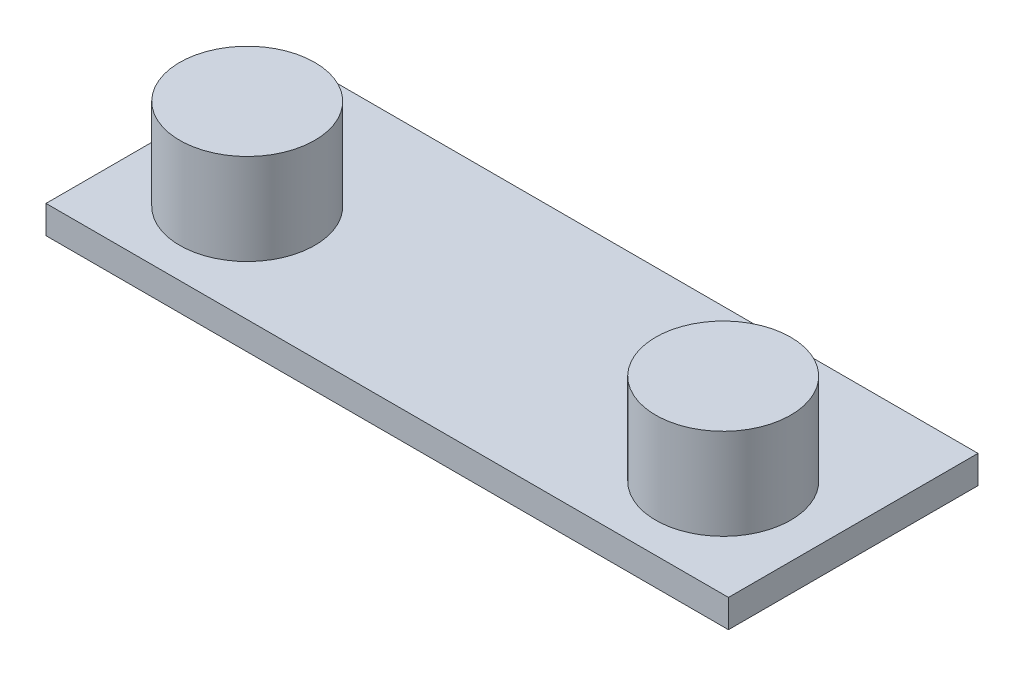
ISO-10303-21;
HEADER;
FILE_DESCRIPTION(('STEP AP214'),'2;1');
FILE_NAME('part.step','',(''),(''),'','','');
FILE_SCHEMA(('AUTOMOTIVE_DESIGN { 1 0 10303 214 1 1 1 1 }'));
ENDSEC;
DATA;
#1=APPLICATION_CONTEXT('core data for automotive mechanical design processes');
#2=APPLICATION_PROTOCOL_DEFINITION('international standard','automotive_design',2000,#1);
#3=PRODUCT_CONTEXT('',#1,'mechanical');
#4=PRODUCT('Part','Part','',(#3));
#5=PRODUCT_RELATED_PRODUCT_CATEGORY('part','',(#4));
#6=PRODUCT_DEFINITION_FORMATION('','',#4);
#7=PRODUCT_DEFINITION_CONTEXT('part definition',#1,'design');
#8=PRODUCT_DEFINITION('design','',#6,#7);
#9=PRODUCT_DEFINITION_SHAPE('','',#8);
#10=(LENGTH_UNIT() NAMED_UNIT(*) SI_UNIT(.MILLI.,.METRE.));
#11=(NAMED_UNIT(*) PLANE_ANGLE_UNIT() SI_UNIT($,.RADIAN.));
#12=(NAMED_UNIT(*) SI_UNIT($,.STERADIAN.) SOLID_ANGLE_UNIT());
#13=UNCERTAINTY_MEASURE_WITH_UNIT(LENGTH_MEASURE(1.E-05),#10,'distance_accuracy_value','');
#14=(GEOMETRIC_REPRESENTATION_CONTEXT(3) GLOBAL_UNCERTAINTY_ASSIGNED_CONTEXT((#13)) GLOBAL_UNIT_ASSIGNED_CONTEXT((#10,
#11,#12)) REPRESENTATION_CONTEXT('',''));
#15=CARTESIAN_POINT('',(0.,0.,0.));
#16=DIRECTION('',(0.,0.,1.));
#17=DIRECTION('',(1.,0.,0.));
#18=AXIS2_PLACEMENT_3D('',#15,#16,#17);
#19=CARTESIAN_POINT('',(-97.5,8.,35.65));
#20=DIRECTION('',(1.,0.,0.));
#21=DIRECTION('',(0.,0.,-1.));
#22=AXIS2_PLACEMENT_3D('',#19,#20,#21);
#23=PLANE('',#22);
#24=DIRECTION('',(0.,0.,1.));
#25=VECTOR('',#24,1.);
#26=CARTESIAN_POINT('',(-97.5,0.,35.65));
#27=LINE('',#26,#25);
#28=CARTESIAN_POINT('',(-97.5,0.,-35.65));
#29=VERTEX_POINT('',#28);
#30=CARTESIAN_POINT('',(-97.5,0.,35.65));
#31=VERTEX_POINT('',#30);
#32=EDGE_CURVE('E99',#29,#31,#27,.T.);
#33=ORIENTED_EDGE('',*,*,#32,.T.);
#34=DIRECTION('',(0.,-1.,0.));
#35=VECTOR('',#34,1.);
#36=CARTESIAN_POINT('',(-97.5,8.,35.65));
#37=LINE('',#36,#35);
#38=CARTESIAN_POINT('',(-97.5,8.,35.65));
#39=VERTEX_POINT('',#38);
#40=EDGE_CURVE('E11',#39,#31,#37,.T.);
#41=ORIENTED_EDGE('',*,*,#40,.F.);
#42=DIRECTION('',(0.,0.,1.));
#43=VECTOR('',#42,1.);
#44=CARTESIAN_POINT('',(-97.5,8.,35.65));
#45=LINE('',#44,#43);
#46=CARTESIAN_POINT('',(-97.5,8.,-35.65));
#47=VERTEX_POINT('',#46);
#48=EDGE_CURVE('E87',#47,#39,#45,.T.);
#49=ORIENTED_EDGE('',*,*,#48,.F.);
#50=DIRECTION('',(0.,-1.,0.));
#51=VECTOR('',#50,1.);
#52=CARTESIAN_POINT('',(-97.5,8.,-35.65));
#53=LINE('',#52,#51);
#54=EDGE_CURVE('E95',#47,#29,#53,.T.);
#55=ORIENTED_EDGE('',*,*,#54,.T.);
#56=EDGE_LOOP('',(#33,#41,#49,#55));
#57=FACE_BOUND('',#56,.T.);
#58=ADVANCED_FACE('F36',(#57),#23,.F.);
#59=CARTESIAN_POINT('',(97.5,8.,35.65));
#60=DIRECTION('',(0.,0.,-1.));
#61=DIRECTION('',(-1.,0.,0.));
#62=AXIS2_PLACEMENT_3D('',#59,#60,#61);
#63=PLANE('',#62);
#64=DIRECTION('',(1.,0.,0.));
#65=VECTOR('',#64,1.);
#66=CARTESIAN_POINT('',(97.5,0.,35.65));
#67=LINE('',#66,#65);
#68=CARTESIAN_POINT('',(97.5,0.,35.65));
#69=VERTEX_POINT('',#68);
#70=EDGE_CURVE('E91',#31,#69,#67,.T.);
#71=ORIENTED_EDGE('',*,*,#70,.T.);
#72=DIRECTION('',(0.,-1.,0.));
#73=VECTOR('',#72,1.);
#74=CARTESIAN_POINT('',(97.5,8.,35.65));
#75=LINE('',#74,#73);
#76=CARTESIAN_POINT('',(97.5,8.,35.65));
#77=VERTEX_POINT('',#76);
#78=EDGE_CURVE('E44',#77,#69,#75,.T.);
#79=ORIENTED_EDGE('',*,*,#78,.F.);
#80=DIRECTION('',(1.,0.,0.));
#81=VECTOR('',#80,1.);
#82=CARTESIAN_POINT('',(97.5,8.,35.65));
#83=LINE('',#82,#81);
#84=EDGE_CURVE('E82',#39,#77,#83,.T.);
#85=ORIENTED_EDGE('',*,*,#84,.F.);
#86=ORIENTED_EDGE('',*,*,#40,.T.);
#87=EDGE_LOOP('',(#71,#79,#85,#86));
#88=FACE_BOUND('',#87,.T.);
#89=ADVANCED_FACE('F90',(#88),#63,.F.);
#90=CARTESIAN_POINT('',(97.5,8.,35.65));
#91=DIRECTION('',(-1.,0.,0.));
#92=DIRECTION('',(0.,0.,1.));
#93=AXIS2_PLACEMENT_3D('',#90,#91,#92);
#94=PLANE('',#93);
#95=DIRECTION('',(0.,0.,-1.));
#96=VECTOR('',#95,1.);
#97=CARTESIAN_POINT('',(97.5,0.,35.65));
#98=LINE('',#97,#96);
#99=CARTESIAN_POINT('',(97.5,0.,-35.65));
#100=VERTEX_POINT('',#99);
#101=EDGE_CURVE('E69',#69,#100,#98,.T.);
#102=ORIENTED_EDGE('',*,*,#101,.T.);
#103=DIRECTION('',(0.,-1.,0.));
#104=VECTOR('',#103,1.);
#105=CARTESIAN_POINT('',(97.5,8.,-35.65));
#106=LINE('',#105,#104);
#107=CARTESIAN_POINT('',(97.5,8.,-35.65));
#108=VERTEX_POINT('',#107);
#109=EDGE_CURVE('E92',#108,#100,#106,.T.);
#110=ORIENTED_EDGE('',*,*,#109,.F.);
#111=DIRECTION('',(0.,0.,-1.));
#112=VECTOR('',#111,1.);
#113=CARTESIAN_POINT('',(97.5,8.,35.65));
#114=LINE('',#113,#112);
#115=EDGE_CURVE('E85',#77,#108,#114,.T.);
#116=ORIENTED_EDGE('',*,*,#115,.F.);
#117=ORIENTED_EDGE('',*,*,#78,.T.);
#118=EDGE_LOOP('',(#102,#110,#116,#117));
#119=FACE_BOUND('',#118,.T.);
#120=ADVANCED_FACE('F93',(#119),#94,.F.);
#121=CARTESIAN_POINT('',(97.5,8.,-35.65));
#122=DIRECTION('',(0.,0.,1.));
#123=DIRECTION('',(1.,0.,0.));
#124=AXIS2_PLACEMENT_3D('',#121,#122,#123);
#125=PLANE('',#124);
#126=DIRECTION('',(-1.,0.,0.));
#127=VECTOR('',#126,1.);
#128=CARTESIAN_POINT('',(97.5,0.,-35.65));
#129=LINE('',#128,#127);
#130=EDGE_CURVE('E75',#100,#29,#129,.T.);
#131=ORIENTED_EDGE('',*,*,#130,.T.);
#132=ORIENTED_EDGE('',*,*,#54,.F.);
#133=DIRECTION('',(-1.,0.,0.));
#134=VECTOR('',#133,1.);
#135=CARTESIAN_POINT('',(97.5,8.,-35.65));
#136=LINE('',#135,#134);
#137=EDGE_CURVE('E52',#108,#47,#136,.T.);
#138=ORIENTED_EDGE('',*,*,#137,.F.);
#139=ORIENTED_EDGE('',*,*,#109,.T.);
#140=EDGE_LOOP('',(#131,#132,#138,#139));
#141=FACE_BOUND('',#140,.T.);
#142=ADVANCED_FACE('F107',(#141),#125,.F.);
#143=CARTESIAN_POINT('',(0.,8.,0.));
#144=DIRECTION('',(0.,1.,0.));
#145=DIRECTION('',(0.,0.,1.));
#146=AXIS2_PLACEMENT_3D('',#143,#144,#145);
#147=PLANE('',#146);
#148=CARTESIAN_POINT('',(-68.,8.,7.65));
#149=DIRECTION('',(0.,1.,0.));
#150=DIRECTION('',(0.,0.,1.));
#151=AXIS2_PLACEMENT_3D('',#148,#149,#150);
#152=CIRCLE('',#151,19.3);
#153=CARTESIAN_POINT('',(-68.,8.,-11.65));
#154=VERTEX_POINT('',#153);
#155=EDGE_CURVE('E119',#154,#154,#152,.T.);
#156=ORIENTED_EDGE('',*,*,#155,.F.);
#157=EDGE_LOOP('',(#156));
#158=FACE_BOUND('',#157,.T.);
#159=CARTESIAN_POINT('',(68.,8.,7.64999999999999));
#160=DIRECTION('',(0.,1.,0.));
#161=DIRECTION('',(0.,0.,1.));
#162=AXIS2_PLACEMENT_3D('',#159,#160,#161);
#163=CIRCLE('',#162,19.3);
#164=CARTESIAN_POINT('',(68.,8.,-11.65));
#165=VERTEX_POINT('',#164);
#166=EDGE_CURVE('E113',#165,#165,#163,.T.);
#167=ORIENTED_EDGE('',*,*,#166,.F.);
#168=EDGE_LOOP('',(#167));
#169=FACE_BOUND('',#168,.T.);
#170=ORIENTED_EDGE('',*,*,#48,.T.);
#171=ORIENTED_EDGE('',*,*,#84,.T.);
#172=ORIENTED_EDGE('',*,*,#115,.T.);
#173=ORIENTED_EDGE('',*,*,#137,.T.);
#174=EDGE_LOOP('',(#170,#171,#172,#173));
#175=FACE_BOUND('',#174,.T.);
#176=ADVANCED_FACE('F83',(#158,#169,#175),#147,.T.);
#177=CARTESIAN_POINT('',(0.,0.,0.));
#178=DIRECTION('',(0.,1.,0.));
#179=DIRECTION('',(0.,0.,1.));
#180=AXIS2_PLACEMENT_3D('',#177,#178,#179);
#181=PLANE('',#180);
#182=ORIENTED_EDGE('',*,*,#32,.F.);
#183=ORIENTED_EDGE('',*,*,#130,.F.);
#184=ORIENTED_EDGE('',*,*,#101,.F.);
#185=ORIENTED_EDGE('',*,*,#70,.F.);
#186=EDGE_LOOP('',(#182,#183,#184,#185));
#187=FACE_BOUND('',#186,.T.);
#188=ADVANCED_FACE('F110',(#187),#181,.F.);
#189=CARTESIAN_POINT('',(68.,34.,7.64999999999999));
#190=DIRECTION('',(0.,-1.,0.));
#191=DIRECTION('',(0.,0.,-1.));
#192=AXIS2_PLACEMENT_3D('',#189,#190,#191);
#193=CYLINDRICAL_SURFACE('',#192,19.3);
#194=CARTESIAN_POINT('',(68.,34.,7.64999999999999));
#195=DIRECTION('',(0.,1.,0.));
#196=DIRECTION('',(0.,0.,1.));
#197=AXIS2_PLACEMENT_3D('',#194,#195,#196);
#198=CIRCLE('',#197,19.3);
#199=CARTESIAN_POINT('',(68.,34.,-11.65));
#200=VERTEX_POINT('',#199);
#201=EDGE_CURVE('E102',#200,#200,#198,.T.);
#202=CARTESIAN_POINT('',(68.,34.,-11.65));
#203=CARTESIAN_POINT('',(68.,33.7291666666667,-11.65));
#204=CARTESIAN_POINT('',(68.,33.4583333333333,-11.65));
#205=CARTESIAN_POINT('',(68.,32.9166666666667,-11.65));
#206=CARTESIAN_POINT('',(68.,32.6458333333333,-11.65));
#207=CARTESIAN_POINT('',(68.,32.1041666666667,-11.65));
#208=CARTESIAN_POINT('',(68.,31.8333333333333,-11.65));
#209=CARTESIAN_POINT('',(68.,31.2916666666667,-11.65));
#210=CARTESIAN_POINT('',(68.,31.0208333333333,-11.65));
#211=CARTESIAN_POINT('',(68.,30.4791666666667,-11.65));
#212=CARTESIAN_POINT('',(68.,30.2083333333333,-11.65));
#213=CARTESIAN_POINT('',(68.,29.6666666666667,-11.65));
#214=CARTESIAN_POINT('',(68.,29.3958333333333,-11.65));
#215=CARTESIAN_POINT('',(68.,28.8541666666667,-11.65));
#216=CARTESIAN_POINT('',(68.,28.5833333333333,-11.65));
#217=CARTESIAN_POINT('',(68.,28.0416666666667,-11.65));
#218=CARTESIAN_POINT('',(68.,27.7708333333333,-11.65));
#219=CARTESIAN_POINT('',(68.,27.2291666666667,-11.65));
#220=CARTESIAN_POINT('',(68.,26.9583333333333,-11.65));
#221=CARTESIAN_POINT('',(68.,26.4166666666667,-11.65));
#222=CARTESIAN_POINT('',(68.,26.1458333333333,-11.65));
#223=CARTESIAN_POINT('',(68.,25.6041666666667,-11.65));
#224=CARTESIAN_POINT('',(68.,25.3333333333333,-11.65));
#225=CARTESIAN_POINT('',(68.,24.7916666666667,-11.65));
#226=CARTESIAN_POINT('',(68.,24.5208333333333,-11.65));
#227=CARTESIAN_POINT('',(68.,23.9791666666667,-11.65));
#228=CARTESIAN_POINT('',(68.,23.7083333333333,-11.65));
#229=CARTESIAN_POINT('',(68.,23.1666666666667,-11.65));
#230=CARTESIAN_POINT('',(68.,22.8958333333333,-11.65));
#231=CARTESIAN_POINT('',(68.,22.3541666666667,-11.65));
#232=CARTESIAN_POINT('',(68.,22.0833333333333,-11.65));
#233=CARTESIAN_POINT('',(68.,21.5416666666667,-11.65));
#234=CARTESIAN_POINT('',(68.,21.2708333333333,-11.65));
#235=CARTESIAN_POINT('',(68.,20.7291666666667,-11.65));
#236=CARTESIAN_POINT('',(68.,20.4583333333333,-11.65));
#237=CARTESIAN_POINT('',(68.,19.9166666666667,-11.65));
#238=CARTESIAN_POINT('',(68.,19.6458333333333,-11.65));
#239=CARTESIAN_POINT('',(68.,19.1041666666667,-11.65));
#240=CARTESIAN_POINT('',(68.,18.8333333333333,-11.65));
#241=CARTESIAN_POINT('',(68.,18.2916666666667,-11.65));
#242=CARTESIAN_POINT('',(68.,18.0208333333333,-11.65));
#243=CARTESIAN_POINT('',(68.,17.4791666666667,-11.65));
#244=CARTESIAN_POINT('',(68.,17.2083333333333,-11.65));
#245=CARTESIAN_POINT('',(68.,16.6666666666667,-11.65));
#246=CARTESIAN_POINT('',(68.,16.3958333333333,-11.65));
#247=CARTESIAN_POINT('',(68.,15.8541666666667,-11.65));
#248=CARTESIAN_POINT('',(68.,15.5833333333333,-11.65));
#249=CARTESIAN_POINT('',(68.,15.0416666666667,-11.65));
#250=CARTESIAN_POINT('',(68.,14.7708333333333,-11.65));
#251=CARTESIAN_POINT('',(68.,14.2291666666667,-11.65));
#252=CARTESIAN_POINT('',(68.,13.9583333333333,-11.65));
#253=CARTESIAN_POINT('',(68.,13.4166666666667,-11.65));
#254=CARTESIAN_POINT('',(68.,13.1458333333333,-11.65));
#255=CARTESIAN_POINT('',(68.,12.6041666666667,-11.65));
#256=CARTESIAN_POINT('',(68.,12.3333333333333,-11.65));
#257=CARTESIAN_POINT('',(68.,11.7916666666667,-11.65));
#258=CARTESIAN_POINT('',(68.,11.5208333333333,-11.65));
#259=CARTESIAN_POINT('',(68.,10.9791666666667,-11.65));
#260=CARTESIAN_POINT('',(68.,10.7083333333333,-11.65));
#261=CARTESIAN_POINT('',(68.,10.1666666666667,-11.65));
#262=CARTESIAN_POINT('',(68.,9.89583333333333,-11.65));
#263=CARTESIAN_POINT('',(68.,9.35416666666666,-11.65));
#264=CARTESIAN_POINT('',(68.,9.08333333333333,-11.65));
#265=CARTESIAN_POINT('',(68.,8.54166666666666,-11.65));
#266=CARTESIAN_POINT('',(68.,8.27083333333333,-11.65));
#267=CARTESIAN_POINT('',(68.,8.,-11.65));
#268=B_SPLINE_CURVE_WITH_KNOTS('',3,(#202,#203,#204,#205,#206,#207,#208,#209,#210,#211,#212,
#213,#214,#215,#216,#217,#218,#219,#220,#221,#222,#223,#224,#225,#226,#227,#228,#229,#230,#231,
#232,#233,#234,#235,#236,#237,#238,#239,#240,#241,#242,#243,#244,#245,#246,#247,#248,#249,#250,
#251,#252,#253,#254,#255,#256,#257,#258,#259,#260,#261,#262,#263,#264,#265,#266,#267),
.UNSPECIFIED.,.F.,.F.,(4,2,2,2,2,2,2,2,2,2,2,2,2,2,2,2,2,2,2,2,2,2,2,2,2,2,2,2,2,2,2,2,4),(0.,
0.812500000000001,1.625,2.4375,3.25,4.0625,4.875,5.68750000000001,6.50000000000001,7.3125,8.125,
8.93750000000001,9.75,10.5625,11.375,12.1875,13.,13.8125,14.625,15.4375,16.25,17.0625,17.875,
18.6875,19.5,20.3125,21.125,21.9375,22.75,23.5625,24.375,25.1875,26.),.UNSPECIFIED.);
#269=EDGE_CURVE('BSEAM139',#200,#165,#268,.T.);
#270=ORIENTED_EDGE('',*,*,#201,.F.);
#271=ORIENTED_EDGE('',*,*,#166,.T.);
#272=ORIENTED_EDGE('',*,*,#269,.T.);
#273=ORIENTED_EDGE('',*,*,#269,.F.);
#274=EDGE_LOOP('',(#270,#272,#271,#273));
#275=FACE_BOUND('',#274,.T.);
#276=ADVANCED_FACE('F139',(#275),#193,.T.);
#277=CARTESIAN_POINT('',(68.,34.,7.64999999999999));
#278=DIRECTION('',(0.,1.,0.));
#279=DIRECTION('',(0.,0.,1.));
#280=AXIS2_PLACEMENT_3D('',#277,#278,#279);
#281=PLANE('',#280);
#282=ORIENTED_EDGE('',*,*,#201,.T.);
#283=EDGE_LOOP('',(#282));
#284=FACE_BOUND('',#283,.T.);
#285=ADVANCED_FACE('F130',(#284),#281,.T.);
#286=CARTESIAN_POINT('',(-68.,34.,7.65));
#287=DIRECTION('',(0.,-1.,0.));
#288=DIRECTION('',(0.,0.,-1.));
#289=AXIS2_PLACEMENT_3D('',#286,#287,#288);
#290=CYLINDRICAL_SURFACE('',#289,19.3);
#291=CARTESIAN_POINT('',(-68.,34.,7.65));
#292=DIRECTION('',(0.,1.,0.));
#293=DIRECTION('',(0.,0.,1.));
#294=AXIS2_PLACEMENT_3D('',#291,#292,#293);
#295=CIRCLE('',#294,19.3);
#296=CARTESIAN_POINT('',(-68.,34.,-11.65));
#297=VERTEX_POINT('',#296);
#298=EDGE_CURVE('E116',#297,#297,#295,.T.);
#299=CARTESIAN_POINT('',(-68.,34.,-11.65));
#300=CARTESIAN_POINT('',(-68.,33.7291666666667,-11.65));
#301=CARTESIAN_POINT('',(-68.,33.4583333333333,-11.65));
#302=CARTESIAN_POINT('',(-68.,32.9166666666667,-11.65));
#303=CARTESIAN_POINT('',(-68.,32.6458333333333,-11.65));
#304=CARTESIAN_POINT('',(-68.,32.1041666666667,-11.65));
#305=CARTESIAN_POINT('',(-68.,31.8333333333333,-11.65));
#306=CARTESIAN_POINT('',(-68.,31.2916666666667,-11.65));
#307=CARTESIAN_POINT('',(-68.,31.0208333333333,-11.65));
#308=CARTESIAN_POINT('',(-68.,30.4791666666667,-11.65));
#309=CARTESIAN_POINT('',(-68.,30.2083333333333,-11.65));
#310=CARTESIAN_POINT('',(-68.,29.6666666666667,-11.65));
#311=CARTESIAN_POINT('',(-68.,29.3958333333333,-11.65));
#312=CARTESIAN_POINT('',(-68.,28.8541666666667,-11.65));
#313=CARTESIAN_POINT('',(-68.,28.5833333333333,-11.65));
#314=CARTESIAN_POINT('',(-68.,28.0416666666667,-11.65));
#315=CARTESIAN_POINT('',(-68.,27.7708333333333,-11.65));
#316=CARTESIAN_POINT('',(-68.,27.2291666666667,-11.65));
#317=CARTESIAN_POINT('',(-68.,26.9583333333333,-11.65));
#318=CARTESIAN_POINT('',(-68.,26.4166666666667,-11.65));
#319=CARTESIAN_POINT('',(-68.,26.1458333333333,-11.65));
#320=CARTESIAN_POINT('',(-68.,25.6041666666667,-11.65));
#321=CARTESIAN_POINT('',(-68.,25.3333333333333,-11.65));
#322=CARTESIAN_POINT('',(-68.,24.7916666666667,-11.65));
#323=CARTESIAN_POINT('',(-68.,24.5208333333333,-11.65));
#324=CARTESIAN_POINT('',(-68.,23.9791666666667,-11.65));
#325=CARTESIAN_POINT('',(-68.,23.7083333333333,-11.65));
#326=CARTESIAN_POINT('',(-68.,23.1666666666667,-11.65));
#327=CARTESIAN_POINT('',(-68.,22.8958333333333,-11.65));
#328=CARTESIAN_POINT('',(-68.,22.3541666666667,-11.65));
#329=CARTESIAN_POINT('',(-68.,22.0833333333333,-11.65));
#330=CARTESIAN_POINT('',(-68.,21.5416666666667,-11.65));
#331=CARTESIAN_POINT('',(-68.,21.2708333333333,-11.65));
#332=CARTESIAN_POINT('',(-68.,20.7291666666667,-11.65));
#333=CARTESIAN_POINT('',(-68.,20.4583333333333,-11.65));
#334=CARTESIAN_POINT('',(-68.,19.9166666666667,-11.65));
#335=CARTESIAN_POINT('',(-68.,19.6458333333333,-11.65));
#336=CARTESIAN_POINT('',(-68.,19.1041666666667,-11.65));
#337=CARTESIAN_POINT('',(-68.,18.8333333333333,-11.65));
#338=CARTESIAN_POINT('',(-68.,18.2916666666667,-11.65));
#339=CARTESIAN_POINT('',(-68.,18.0208333333333,-11.65));
#340=CARTESIAN_POINT('',(-68.,17.4791666666667,-11.65));
#341=CARTESIAN_POINT('',(-68.,17.2083333333333,-11.65));
#342=CARTESIAN_POINT('',(-68.,16.6666666666667,-11.65));
#343=CARTESIAN_POINT('',(-68.,16.3958333333333,-11.65));
#344=CARTESIAN_POINT('',(-68.,15.8541666666667,-11.65));
#345=CARTESIAN_POINT('',(-68.,15.5833333333333,-11.65));
#346=CARTESIAN_POINT('',(-68.,15.0416666666667,-11.65));
#347=CARTESIAN_POINT('',(-68.,14.7708333333333,-11.65));
#348=CARTESIAN_POINT('',(-68.,14.2291666666667,-11.65));
#349=CARTESIAN_POINT('',(-68.,13.9583333333333,-11.65));
#350=CARTESIAN_POINT('',(-68.,13.4166666666667,-11.65));
#351=CARTESIAN_POINT('',(-68.,13.1458333333333,-11.65));
#352=CARTESIAN_POINT('',(-68.,12.6041666666667,-11.65));
#353=CARTESIAN_POINT('',(-68.,12.3333333333333,-11.65));
#354=CARTESIAN_POINT('',(-68.,11.7916666666667,-11.65));
#355=CARTESIAN_POINT('',(-68.,11.5208333333333,-11.65));
#356=CARTESIAN_POINT('',(-68.,10.9791666666667,-11.65));
#357=CARTESIAN_POINT('',(-68.,10.7083333333333,-11.65));
#358=CARTESIAN_POINT('',(-68.,10.1666666666667,-11.65));
#359=CARTESIAN_POINT('',(-68.,9.89583333333333,-11.65));
#360=CARTESIAN_POINT('',(-68.,9.35416666666666,-11.65));
#361=CARTESIAN_POINT('',(-68.,9.08333333333333,-11.65));
#362=CARTESIAN_POINT('',(-68.,8.54166666666666,-11.65));
#363=CARTESIAN_POINT('',(-68.,8.27083333333333,-11.65));
#364=CARTESIAN_POINT('',(-68.,8.,-11.65));
#365=B_SPLINE_CURVE_WITH_KNOTS('',3,(#299,#300,#301,#302,#303,#304,#305,#306,#307,#308,#309,
#310,#311,#312,#313,#314,#315,#316,#317,#318,#319,#320,#321,#322,#323,#324,#325,#326,#327,#328,
#329,#330,#331,#332,#333,#334,#335,#336,#337,#338,#339,#340,#341,#342,#343,#344,#345,#346,#347,
#348,#349,#350,#351,#352,#353,#354,#355,#356,#357,#358,#359,#360,#361,#362,#363,#364),
.UNSPECIFIED.,.F.,.F.,(4,2,2,2,2,2,2,2,2,2,2,2,2,2,2,2,2,2,2,2,2,2,2,2,2,2,2,2,2,2,2,2,4),(0.,
0.812500000000001,1.625,2.4375,3.25,4.0625,4.875,5.68750000000001,6.50000000000001,7.3125,8.125,
8.93750000000001,9.75,10.5625,11.375,12.1875,13.,13.8125,14.625,15.4375,16.25,17.0625,17.875,
18.6875,19.5,20.3125,21.125,21.9375,22.75,23.5625,24.375,25.1875,26.),.UNSPECIFIED.);
#366=EDGE_CURVE('BSEAM127',#297,#154,#365,.T.);
#367=ORIENTED_EDGE('',*,*,#298,.F.);
#368=ORIENTED_EDGE('',*,*,#155,.T.);
#369=ORIENTED_EDGE('',*,*,#366,.T.);
#370=ORIENTED_EDGE('',*,*,#366,.F.);
#371=EDGE_LOOP('',(#367,#369,#368,#370));
#372=FACE_BOUND('',#371,.T.);
#373=ADVANCED_FACE('F127',(#372),#290,.T.);
#374=CARTESIAN_POINT('',(-68.,34.,7.65));
#375=DIRECTION('',(0.,1.,0.));
#376=DIRECTION('',(0.,0.,1.));
#377=AXIS2_PLACEMENT_3D('',#374,#375,#376);
#378=PLANE('',#377);
#379=ORIENTED_EDGE('',*,*,#298,.T.);
#380=EDGE_LOOP('',(#379));
#381=FACE_BOUND('',#380,.T.);
#382=ADVANCED_FACE('F125',(#381),#378,.T.);
#383=CLOSED_SHELL('',(#58,#89,#120,#142,#176,#188,#276,#285,#373,#382));
#384=MANIFOLD_SOLID_BREP('B2',#383);
#385=ADVANCED_BREP_SHAPE_REPRESENTATION('',(#18,#384),#14);
#386=SHAPE_DEFINITION_REPRESENTATION(#9,#385);
ENDSEC;
END-ISO-10303-21;
